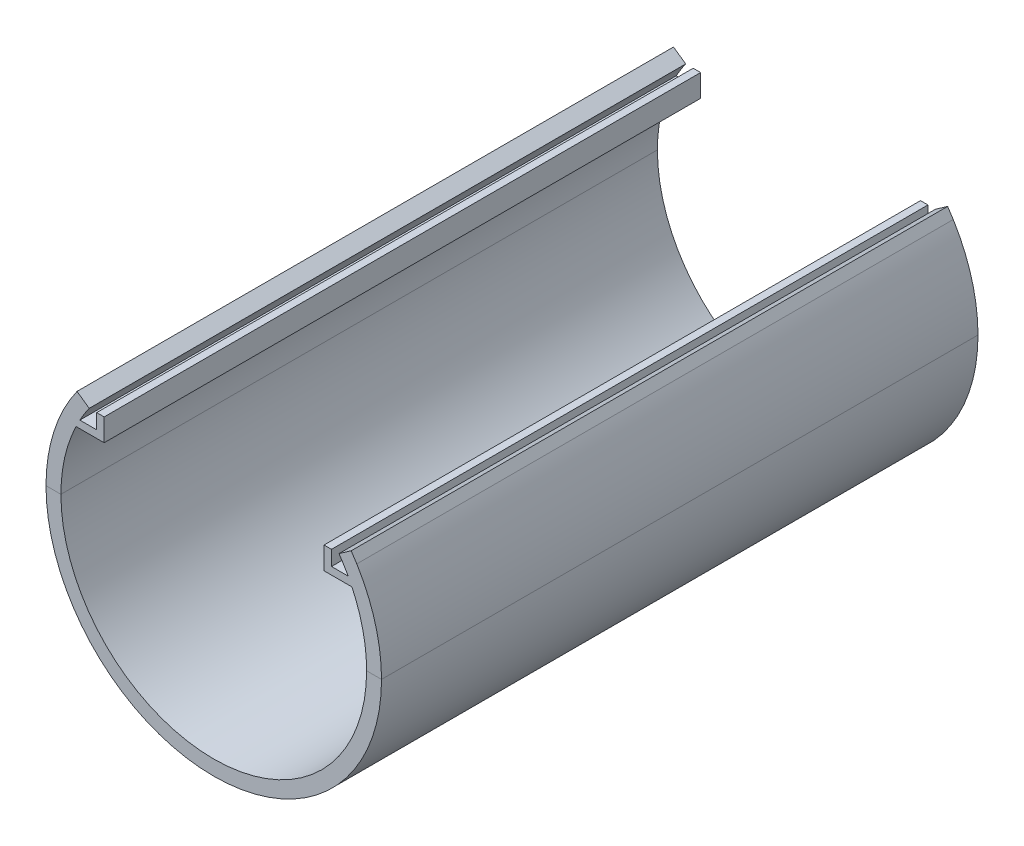
ISO-10303-21;
HEADER;
FILE_DESCRIPTION(('STEP AP214'),'2;1');
FILE_NAME('part.step','',(''),(''),'','','');
FILE_SCHEMA(('AUTOMOTIVE_DESIGN { 1 0 10303 214 1 1 1 1 }'));
ENDSEC;
DATA;
#1=APPLICATION_CONTEXT('core data for automotive mechanical design processes');
#2=APPLICATION_PROTOCOL_DEFINITION('international standard','automotive_design',2000,#1);
#3=PRODUCT_CONTEXT('',#1,'mechanical');
#4=PRODUCT('Part','Part','',(#3));
#5=PRODUCT_RELATED_PRODUCT_CATEGORY('part','',(#4));
#6=PRODUCT_DEFINITION_FORMATION('','',#4);
#7=PRODUCT_DEFINITION_CONTEXT('part definition',#1,'design');
#8=PRODUCT_DEFINITION('design','',#6,#7);
#9=PRODUCT_DEFINITION_SHAPE('','',#8);
#10=(LENGTH_UNIT() NAMED_UNIT(*) SI_UNIT(.MILLI.,.METRE.));
#11=(NAMED_UNIT(*) PLANE_ANGLE_UNIT() SI_UNIT($,.RADIAN.));
#12=(NAMED_UNIT(*) SI_UNIT($,.STERADIAN.) SOLID_ANGLE_UNIT());
#13=UNCERTAINTY_MEASURE_WITH_UNIT(LENGTH_MEASURE(1.E-05),#10,'distance_accuracy_value','');
#14=(GEOMETRIC_REPRESENTATION_CONTEXT(3) GLOBAL_UNCERTAINTY_ASSIGNED_CONTEXT((#13)) GLOBAL_UNIT_ASSIGNED_CONTEXT((#10,
#11,#12)) REPRESENTATION_CONTEXT('',''));
#15=CARTESIAN_POINT('',(0.,0.,0.));
#16=DIRECTION('',(0.,0.,1.));
#17=DIRECTION('',(1.,0.,0.));
#18=AXIS2_PLACEMENT_3D('',#15,#16,#17);
#19=CARTESIAN_POINT('',(0.,0.,0.));
#20=DIRECTION('',(0.,0.,1.));
#21=DIRECTION('',(1.,0.,0.));
#22=AXIS2_PLACEMENT_3D('',#19,#20,#21);
#23=PLANE('',#22);
#24=CARTESIAN_POINT('',(0.,0.,0.));
#25=DIRECTION('',(0.,0.,1.));
#26=DIRECTION('',(1.,0.,0.));
#27=AXIS2_PLACEMENT_3D('',#24,#25,#26);
#28=CIRCLE('',#27,20.5);
#29=CARTESIAN_POINT('',(-16.7022728372122,11.8862980810395,0.));
#30=VERTEX_POINT('',#29);
#31=CARTESIAN_POINT('',(-17.9585943284221,9.88629808103946,0.));
#32=VERTEX_POINT('',#31);
#33=EDGE_CURVE('E196',#30,#32,#28,.T.);
#34=ORIENTED_EDGE('',*,*,#33,.T.);
#35=DIRECTION('',(-1.,0.,0.));
#36=VECTOR('',#35,1.);
#37=CARTESIAN_POINT('',(-19.1040811851467,9.88629808103946,0.));
#38=LINE('',#37,#36);
#39=CARTESIAN_POINT('',(-15.7022728372122,9.88629808103946,0.));
#40=VERTEX_POINT('',#39);
#41=EDGE_CURVE('E241',#40,#32,#38,.T.);
#42=ORIENTED_EDGE('',*,*,#41,.F.);
#43=DIRECTION('',(0.,1.,0.));
#44=VECTOR('',#43,1.);
#45=CARTESIAN_POINT('',(-15.7022728372122,11.8862980810395,0.));
#46=LINE('',#45,#44);
#47=CARTESIAN_POINT('',(-15.7022728372122,11.8862980810395,0.));
#48=VERTEX_POINT('',#47);
#49=EDGE_CURVE('E245',#40,#48,#46,.T.);
#50=ORIENTED_EDGE('',*,*,#49,.T.);
#51=DIRECTION('',(1.,0.,0.));
#52=VECTOR('',#51,1.);
#53=CARTESIAN_POINT('',(-14.7022728372122,11.8862980810395,0.));
#54=LINE('',#53,#52);
#55=CARTESIAN_POINT('',(-14.7022728372122,11.8862980810395,0.));
#56=VERTEX_POINT('',#55);
#57=EDGE_CURVE('E250',#48,#56,#54,.T.);
#58=ORIENTED_EDGE('',*,*,#57,.T.);
#59=DIRECTION('',(0.,1.,0.));
#60=VECTOR('',#59,1.);
#61=CARTESIAN_POINT('',(-14.7022728372122,11.8862980810395,0.));
#62=LINE('',#61,#60);
#63=CARTESIAN_POINT('',(-14.7022728372122,8.88629808103946,0.));
#64=VERTEX_POINT('',#63);
#65=EDGE_CURVE('E253',#64,#56,#62,.T.);
#66=ORIENTED_EDGE('',*,*,#65,.F.);
#67=DIRECTION('',(-1.,0.,0.));
#68=VECTOR('',#67,1.);
#69=CARTESIAN_POINT('',(-19.1040811851467,8.88629808103946,0.));
#70=LINE('',#69,#68);
#71=CARTESIAN_POINT('',(-18.4738654973699,8.88629808103946,0.));
#72=VERTEX_POINT('',#71);
#73=EDGE_CURVE('E215',#64,#72,#70,.T.);
#74=ORIENTED_EDGE('',*,*,#73,.T.);
#75=CARTESIAN_POINT('',(-20.5,0.,0.));
#76=VERTEX_POINT('',#75);
#77=EDGE_CURVE('E205',#72,#76,#28,.T.);
#78=ORIENTED_EDGE('',*,*,#77,.T.);
#79=DIRECTION('',(-1.,0.,0.));
#80=VECTOR('',#79,1.);
#81=CARTESIAN_POINT('',(-22.5,0.,0.));
#82=LINE('',#81,#80);
#83=CARTESIAN_POINT('',(-22.5,0.,0.));
#84=VERTEX_POINT('',#83);
#85=EDGE_CURVE('E207',#76,#84,#82,.T.);
#86=ORIENTED_EDGE('',*,*,#85,.T.);
#87=CARTESIAN_POINT('',(0.,0.,0.));
#88=DIRECTION('',(0.,0.,1.));
#89=DIRECTION('',(1.,0.,0.));
#90=AXIS2_PLACEMENT_3D('',#87,#88,#89);
#91=CIRCLE('',#90,22.5);
#92=CARTESIAN_POINT('',(-18.3406205106215,13.0334814721689,0.));
#93=VERTEX_POINT('',#92);
#94=EDGE_CURVE('E103',#93,#84,#91,.T.);
#95=ORIENTED_EDGE('',*,*,#94,.F.);
#96=DIRECTION('',(0.819152044288995,-0.573576436351041,0.));
#97=VECTOR('',#96,1.);
#98=CARTESIAN_POINT('',(-16.7022728372122,11.8862980810395,0.));
#99=LINE('',#98,#97);
#100=EDGE_CURVE('E206',#93,#30,#99,.T.);
#101=ORIENTED_EDGE('',*,*,#100,.T.);
#102=EDGE_LOOP('',(#34,#42,#50,#58,#66,#74,#78,#86,#95,#101));
#103=FACE_BOUND('',#102,.T.);
#104=ADVANCED_FACE('F100',(#103),#23,.F.);
#105=CARTESIAN_POINT('',(0.,0.,80.));
#106=DIRECTION('',(0.,0.,-1.));
#107=DIRECTION('',(-1.,0.,0.));
#108=AXIS2_PLACEMENT_3D('',#105,#106,#107);
#109=PLANE('',#108);
#110=CARTESIAN_POINT('',(0.,0.,80.));
#111=DIRECTION('',(0.,0.,-1.));
#112=DIRECTION('',(-1.,0.,0.));
#113=AXIS2_PLACEMENT_3D('',#110,#111,#112);
#114=CIRCLE('',#113,20.5);
#115=CARTESIAN_POINT('',(-20.5,0.,80.));
#116=VERTEX_POINT('',#115);
#117=CARTESIAN_POINT('',(-18.4738654973699,8.88629808103946,80.));
#118=VERTEX_POINT('',#117);
#119=EDGE_CURVE('E189',#116,#118,#114,.T.);
#120=ORIENTED_EDGE('',*,*,#119,.T.);
#121=DIRECTION('',(1.,0.,0.));
#122=VECTOR('',#121,1.);
#123=CARTESIAN_POINT('',(-19.1040811851467,8.88629808103946,80.));
#124=LINE('',#123,#122);
#125=CARTESIAN_POINT('',(-14.7022728372122,8.88629808103946,80.));
#126=VERTEX_POINT('',#125);
#127=EDGE_CURVE('E246',#118,#126,#124,.T.);
#128=ORIENTED_EDGE('',*,*,#127,.T.);
#129=DIRECTION('',(0.,-1.,0.));
#130=VECTOR('',#129,1.);
#131=CARTESIAN_POINT('',(-14.7022728372122,11.8862980810395,80.));
#132=LINE('',#131,#130);
#133=CARTESIAN_POINT('',(-14.7022728372122,11.8862980810395,80.));
#134=VERTEX_POINT('',#133);
#135=EDGE_CURVE('E258',#134,#126,#132,.T.);
#136=ORIENTED_EDGE('',*,*,#135,.F.);
#137=DIRECTION('',(-1.,0.,0.));
#138=VECTOR('',#137,1.);
#139=CARTESIAN_POINT('',(-14.7022728372122,11.8862980810395,80.));
#140=LINE('',#139,#138);
#141=CARTESIAN_POINT('',(-15.7022728372122,11.8862980810395,80.));
#142=VERTEX_POINT('',#141);
#143=EDGE_CURVE('E109',#134,#142,#140,.T.);
#144=ORIENTED_EDGE('',*,*,#143,.T.);
#145=DIRECTION('',(0.,-1.,0.));
#146=VECTOR('',#145,1.);
#147=CARTESIAN_POINT('',(-15.7022728372122,11.8862980810395,80.));
#148=LINE('',#147,#146);
#149=CARTESIAN_POINT('',(-15.7022728372122,9.88629808103946,80.));
#150=VERTEX_POINT('',#149);
#151=EDGE_CURVE('E13',#142,#150,#148,.T.);
#152=ORIENTED_EDGE('',*,*,#151,.T.);
#153=DIRECTION('',(1.,0.,0.));
#154=VECTOR('',#153,1.);
#155=CARTESIAN_POINT('',(-19.1040811851467,9.88629808103946,80.));
#156=LINE('',#155,#154);
#157=CARTESIAN_POINT('',(-17.9585943284221,9.88629808103946,80.));
#158=VERTEX_POINT('',#157);
#159=EDGE_CURVE('E186',#158,#150,#156,.T.);
#160=ORIENTED_EDGE('',*,*,#159,.F.);
#161=CARTESIAN_POINT('',(-16.7022728372122,11.8862980810395,80.));
#162=VERTEX_POINT('',#161);
#163=EDGE_CURVE('E180',#158,#162,#114,.T.);
#164=ORIENTED_EDGE('',*,*,#163,.T.);
#165=DIRECTION('',(-0.819152044288995,0.573576436351041,0.));
#166=VECTOR('',#165,1.);
#167=CARTESIAN_POINT('',(-16.7022728372122,11.8862980810395,80.));
#168=LINE('',#167,#166);
#169=CARTESIAN_POINT('',(-18.3406205106215,13.0334814721689,80.));
#170=VERTEX_POINT('',#169);
#171=EDGE_CURVE('E185',#162,#170,#168,.T.);
#172=ORIENTED_EDGE('',*,*,#171,.T.);
#173=CARTESIAN_POINT('',(0.,0.,80.));
#174=DIRECTION('',(0.,0.,-1.));
#175=DIRECTION('',(-1.,0.,0.));
#176=AXIS2_PLACEMENT_3D('',#173,#174,#175);
#177=CIRCLE('',#176,22.5);
#178=CARTESIAN_POINT('',(-22.5,0.,80.));
#179=VERTEX_POINT('',#178);
#180=EDGE_CURVE('E200',#179,#170,#177,.T.);
#181=ORIENTED_EDGE('',*,*,#180,.F.);
#182=DIRECTION('',(1.,0.,0.));
#183=VECTOR('',#182,1.);
#184=CARTESIAN_POINT('',(-22.5,0.,80.));
#185=LINE('',#184,#183);
#186=EDGE_CURVE('E197',#179,#116,#185,.T.);
#187=ORIENTED_EDGE('',*,*,#186,.T.);
#188=EDGE_LOOP('',(#120,#128,#136,#144,#152,#160,#164,#172,#181,#187));
#189=FACE_BOUND('',#188,.T.);
#190=ADVANCED_FACE('F183',(#189),#109,.F.);
#191=CARTESIAN_POINT('',(-16.7022728372122,11.8862980810395,-15.0317964777569));
#192=DIRECTION('',(0.573576436351041,0.819152044288995,0.));
#193=DIRECTION('',(-0.819152044288995,0.573576436351041,0.));
#194=AXIS2_PLACEMENT_3D('',#191,#192,#193);
#195=PLANE('',#194);
#196=ORIENTED_EDGE('',*,*,#100,.F.);
#197=DIRECTION('',(0.,0.,1.));
#198=VECTOR('',#197,1.);
#199=CARTESIAN_POINT('',(-18.3406205106215,13.0334814721689,-15.0317964777569));
#200=LINE('',#199,#198);
#201=EDGE_CURVE('E173',#93,#170,#200,.T.);
#202=ORIENTED_EDGE('',*,*,#201,.T.);
#203=ORIENTED_EDGE('',*,*,#171,.F.);
#204=DIRECTION('',(0.,0.,1.));
#205=VECTOR('',#204,1.);
#206=CARTESIAN_POINT('',(-16.7022728372122,11.8862980810395,-15.0317964777569));
#207=LINE('',#206,#205);
#208=EDGE_CURVE('E193',#30,#162,#207,.T.);
#209=ORIENTED_EDGE('',*,*,#208,.F.);
#210=EDGE_LOOP('',(#196,#202,#203,#209));
#211=FACE_BOUND('',#210,.T.);
#212=ADVANCED_FACE('F199',(#211),#195,.T.);
#213=CARTESIAN_POINT('',(0.,0.,-15.0317964777569));
#214=DIRECTION('',(0.,0.,1.));
#215=DIRECTION('',(1.,0.,0.));
#216=AXIS2_PLACEMENT_3D('',#213,#214,#215);
#217=CYLINDRICAL_SURFACE('',#216,22.5);
#218=ORIENTED_EDGE('',*,*,#201,.F.);
#219=ORIENTED_EDGE('',*,*,#94,.T.);
#220=DIRECTION('',(0.,0.,1.));
#221=VECTOR('',#220,1.);
#222=CARTESIAN_POINT('',(-22.5,0.,-15.0317964777569));
#223=LINE('',#222,#221);
#224=EDGE_CURVE('E224',#84,#179,#223,.T.);
#225=ORIENTED_EDGE('',*,*,#224,.T.);
#226=ORIENTED_EDGE('',*,*,#180,.T.);
#227=EDGE_LOOP('',(#218,#219,#225,#226));
#228=FACE_BOUND('',#227,.T.);
#229=ADVANCED_FACE('F232',(#228),#217,.T.);
#230=CARTESIAN_POINT('',(-22.5,0.,-15.0317964777569));
#231=DIRECTION('',(0.,-1.,0.));
#232=DIRECTION('',(0.,0.,-1.));
#233=AXIS2_PLACEMENT_3D('',#230,#231,#232);
#234=PLANE('',#233);
#235=ORIENTED_EDGE('',*,*,#85,.F.);
#236=DIRECTION('',(0.,0.,1.));
#237=VECTOR('',#236,1.);
#238=CARTESIAN_POINT('',(-20.5,0.,-15.0317964777569));
#239=LINE('',#238,#237);
#240=EDGE_CURVE('E211',#76,#116,#239,.T.);
#241=ORIENTED_EDGE('',*,*,#240,.T.);
#242=ORIENTED_EDGE('',*,*,#186,.F.);
#243=ORIENTED_EDGE('',*,*,#224,.F.);
#244=EDGE_LOOP('',(#235,#241,#242,#243));
#245=FACE_BOUND('',#244,.T.);
#246=ADVANCED_FACE('F221',(#245),#234,.T.);
#247=CARTESIAN_POINT('',(0.,0.,-15.0317964777569));
#248=DIRECTION('',(0.,0.,1.));
#249=DIRECTION('',(1.,0.,0.));
#250=AXIS2_PLACEMENT_3D('',#247,#248,#249);
#251=CYLINDRICAL_SURFACE('',#250,20.5);
#252=DIRECTION('',(0.,0.,1.));
#253=VECTOR('',#252,1.);
#254=CARTESIAN_POINT('',(-18.4738654973699,8.88629808103946,-15.0317964777569));
#255=LINE('',#254,#253);
#256=EDGE_CURVE('E236',#118,#72,#255,.F.);
#257=ORIENTED_EDGE('',*,*,#256,.F.);
#258=ORIENTED_EDGE('',*,*,#119,.F.);
#259=ORIENTED_EDGE('',*,*,#240,.F.);
#260=ORIENTED_EDGE('',*,*,#77,.F.);
#261=EDGE_LOOP('',(#257,#258,#259,#260));
#262=FACE_BOUND('',#261,.T.);
#263=ADVANCED_FACE('F225',(#262),#251,.F.);
#264=ORIENTED_EDGE('',*,*,#163,.F.);
#265=DIRECTION('',(0.,0.,1.));
#266=VECTOR('',#265,1.);
#267=CARTESIAN_POINT('',(-17.9585943284221,9.88629808103946,-15.0317964777569));
#268=LINE('',#267,#266);
#269=EDGE_CURVE('E234',#158,#32,#268,.F.);
#270=ORIENTED_EDGE('',*,*,#269,.T.);
#271=ORIENTED_EDGE('',*,*,#33,.F.);
#272=ORIENTED_EDGE('',*,*,#208,.T.);
#273=EDGE_LOOP('',(#264,#270,#271,#272));
#274=FACE_BOUND('',#273,.T.);
#275=ADVANCED_FACE('F194',(#274),#251,.F.);
#276=CARTESIAN_POINT('',(-14.7022728372122,11.8862980810395,-15.0317964777569));
#277=DIRECTION('',(-1.,0.,0.));
#278=DIRECTION('',(0.,0.,1.));
#279=AXIS2_PLACEMENT_3D('',#276,#277,#278);
#280=PLANE('',#279);
#281=ORIENTED_EDGE('',*,*,#135,.T.);
#282=DIRECTION('',(0.,0.,1.));
#283=VECTOR('',#282,1.);
#284=CARTESIAN_POINT('',(-14.7022728372122,8.88629808103946,-15.0317964777569));
#285=LINE('',#284,#283);
#286=EDGE_CURVE('E240',#64,#126,#285,.T.);
#287=ORIENTED_EDGE('',*,*,#286,.F.);
#288=ORIENTED_EDGE('',*,*,#65,.T.);
#289=DIRECTION('',(0.,0.,1.));
#290=VECTOR('',#289,1.);
#291=CARTESIAN_POINT('',(-14.7022728372122,11.8862980810395,-15.0317964777569));
#292=LINE('',#291,#290);
#293=EDGE_CURVE('E260',#56,#134,#292,.T.);
#294=ORIENTED_EDGE('',*,*,#293,.T.);
#295=EDGE_LOOP('',(#281,#287,#288,#294));
#296=FACE_BOUND('',#295,.T.);
#297=ADVANCED_FACE('F273',(#296),#280,.F.);
#298=CARTESIAN_POINT('',(-14.7022728372122,11.8862980810395,-15.0317964777569));
#299=DIRECTION('',(0.,1.,0.));
#300=DIRECTION('',(0.,0.,1.));
#301=AXIS2_PLACEMENT_3D('',#298,#299,#300);
#302=PLANE('',#301);
#303=ORIENTED_EDGE('',*,*,#57,.F.);
#304=DIRECTION('',(0.,0.,1.));
#305=VECTOR('',#304,1.);
#306=CARTESIAN_POINT('',(-15.7022728372122,11.8862980810395,-15.0317964777569));
#307=LINE('',#306,#305);
#308=EDGE_CURVE('E118',#48,#142,#307,.T.);
#309=ORIENTED_EDGE('',*,*,#308,.T.);
#310=ORIENTED_EDGE('',*,*,#143,.F.);
#311=ORIENTED_EDGE('',*,*,#293,.F.);
#312=EDGE_LOOP('',(#303,#309,#310,#311));
#313=FACE_BOUND('',#312,.T.);
#314=ADVANCED_FACE('F272',(#313),#302,.T.);
#315=CARTESIAN_POINT('',(-19.1040811851467,8.88629808103946,-15.0317964777569));
#316=DIRECTION('',(0.,-1.,0.));
#317=DIRECTION('',(0.,0.,-1.));
#318=AXIS2_PLACEMENT_3D('',#315,#316,#317);
#319=PLANE('',#318);
#320=ORIENTED_EDGE('',*,*,#127,.F.);
#321=ORIENTED_EDGE('',*,*,#256,.T.);
#322=ORIENTED_EDGE('',*,*,#73,.F.);
#323=ORIENTED_EDGE('',*,*,#286,.T.);
#324=EDGE_LOOP('',(#320,#321,#322,#323));
#325=FACE_BOUND('',#324,.T.);
#326=ADVANCED_FACE('F267',(#325),#319,.T.);
#327=CARTESIAN_POINT('',(-15.7022728372122,11.8862980810395,-15.0317964777569));
#328=DIRECTION('',(-1.,0.,0.));
#329=DIRECTION('',(0.,0.,1.));
#330=AXIS2_PLACEMENT_3D('',#327,#328,#329);
#331=PLANE('',#330);
#332=DIRECTION('',(0.,0.,-1.));
#333=VECTOR('',#332,1.);
#334=CARTESIAN_POINT('',(-15.7022728372122,9.88629808103946,-15.0317964777569));
#335=LINE('',#334,#333);
#336=EDGE_CURVE('E188',#150,#40,#335,.T.);
#337=ORIENTED_EDGE('',*,*,#336,.F.);
#338=ORIENTED_EDGE('',*,*,#151,.F.);
#339=ORIENTED_EDGE('',*,*,#308,.F.);
#340=ORIENTED_EDGE('',*,*,#49,.F.);
#341=EDGE_LOOP('',(#337,#338,#339,#340));
#342=FACE_BOUND('',#341,.T.);
#343=ADVANCED_FACE('F278',(#342),#331,.T.);
#344=CARTESIAN_POINT('',(-19.1040811851467,9.88629808103946,-15.0317964777569));
#345=DIRECTION('',(0.,-1.,0.));
#346=DIRECTION('',(0.,0.,-1.));
#347=AXIS2_PLACEMENT_3D('',#344,#345,#346);
#348=PLANE('',#347);
#349=ORIENTED_EDGE('',*,*,#269,.F.);
#350=ORIENTED_EDGE('',*,*,#159,.T.);
#351=ORIENTED_EDGE('',*,*,#336,.T.);
#352=ORIENTED_EDGE('',*,*,#41,.T.);
#353=EDGE_LOOP('',(#349,#350,#351,#352));
#354=FACE_BOUND('',#353,.T.);
#355=ADVANCED_FACE('F280',(#354),#348,.F.);
#356=CLOSED_SHELL('',(#104,#190,#212,#229,#246,#263,#275,#297,#314,#326,#343,#355));
#357=MANIFOLD_SOLID_BREP('B2',#356);
#358=CARTESIAN_POINT('',(0.,0.,80.));
#359=DIRECTION('',(0.,0.,1.));
#360=DIRECTION('',(1.,0.,0.));
#361=AXIS2_PLACEMENT_3D('',#358,#359,#360);
#362=PLANE('',#361);
#363=CARTESIAN_POINT('',(0.,0.,80.));
#364=DIRECTION('',(0.,0.,1.));
#365=DIRECTION('',(1.,0.,0.));
#366=AXIS2_PLACEMENT_3D('',#363,#364,#365);
#367=CIRCLE('',#366,20.5);
#368=CARTESIAN_POINT('',(20.5,0.,80.));
#369=VERTEX_POINT('',#368);
#370=CARTESIAN_POINT('',(18.5348829046068,8.75831694519647,80.));
#371=VERTEX_POINT('',#370);
#372=EDGE_CURVE('E491',#369,#371,#367,.T.);
#373=ORIENTED_EDGE('',*,*,#372,.F.);
#374=DIRECTION('',(-1.,0.,0.));
#375=VECTOR('',#374,1.);
#376=CARTESIAN_POINT('',(0.,0.,80.));
#377=LINE('',#376,#375);
#378=CARTESIAN_POINT('',(22.5,0.,80.));
#379=VERTEX_POINT('',#378);
#380=EDGE_CURVE('E497',#379,#369,#377,.T.);
#381=ORIENTED_EDGE('',*,*,#380,.F.);
#382=CARTESIAN_POINT('',(0.,0.,80.));
#383=DIRECTION('',(0.,0.,1.));
#384=DIRECTION('',(1.,0.,0.));
#385=AXIS2_PLACEMENT_3D('',#382,#383,#384);
#386=CIRCLE('',#385,22.5);
#387=CARTESIAN_POINT('',(19.1831171246048,11.7583169451965,80.));
#388=VERTEX_POINT('',#387);
#389=EDGE_CURVE('E503',#379,#388,#386,.T.);
#390=ORIENTED_EDGE('',*,*,#389,.T.);
#391=DIRECTION('',(-0.548338985228356,0.836256155300956,0.));
#392=VECTOR('',#391,1.);
#393=CARTESIAN_POINT('',(18.8070190605535,12.3318933815476,80.));
#394=LINE('',#393,#392);
#395=CARTESIAN_POINT('',(18.4309209965023,12.9054698178986,80.));
#396=VERTEX_POINT('',#395);
#397=EDGE_CURVE('E512',#388,#396,#394,.T.);
#398=ORIENTED_EDGE('',*,*,#397,.T.);
#399=DIRECTION('',(0.819152044288991,0.573576436351047,0.));
#400=VECTOR('',#399,1.);
#401=CARTESIAN_POINT('',(0.,0.,80.));
#402=LINE('',#401,#400);
#403=CARTESIAN_POINT('',(16.7926169079243,11.7583169451965,80.));
#404=VERTEX_POINT('',#403);
#405=EDGE_CURVE('E515',#404,#396,#402,.T.);
#406=ORIENTED_EDGE('',*,*,#405,.F.);
#407=CARTESIAN_POINT('',(0.,0.,80.));
#408=DIRECTION('',(0.,0.,1.));
#409=DIRECTION('',(1.,0.,0.));
#410=AXIS2_PLACEMENT_3D('',#407,#408,#409);
#411=CIRCLE('',#410,20.5);
#412=CARTESIAN_POINT('',(18.028456683729,9.75831694519647,80.));
#413=VERTEX_POINT('',#412);
#414=EDGE_CURVE('E518',#413,#404,#411,.T.);
#415=ORIENTED_EDGE('',*,*,#414,.F.);
#416=DIRECTION('',(1.,0.,0.));
#417=VECTOR('',#416,1.);
#418=CARTESIAN_POINT('',(0.,9.75831694519647,80.));
#419=LINE('',#418,#417);
#420=CARTESIAN_POINT('',(15.7926169079243,9.75831694519647,80.));
#421=VERTEX_POINT('',#420);
#422=EDGE_CURVE('E521',#421,#413,#419,.T.);
#423=ORIENTED_EDGE('',*,*,#422,.F.);
#424=DIRECTION('',(0.,-1.,0.));
#425=VECTOR('',#424,1.);
#426=CARTESIAN_POINT('',(15.7926169079243,0.,80.));
#427=LINE('',#426,#425);
#428=CARTESIAN_POINT('',(15.7926169079243,11.7583169451965,80.));
#429=VERTEX_POINT('',#428);
#430=EDGE_CURVE('E524',#429,#421,#427,.T.);
#431=ORIENTED_EDGE('',*,*,#430,.F.);
#432=DIRECTION('',(-1.,0.,0.));
#433=VECTOR('',#432,1.);
#434=CARTESIAN_POINT('',(0.,11.7583169451965,80.));
#435=LINE('',#434,#433);
#436=CARTESIAN_POINT('',(14.7926169079243,11.7583169451965,80.));
#437=VERTEX_POINT('',#436);
#438=EDGE_CURVE('E527',#429,#437,#435,.T.);
#439=ORIENTED_EDGE('',*,*,#438,.T.);
#440=DIRECTION('',(0.,-1.,0.));
#441=VECTOR('',#440,1.);
#442=CARTESIAN_POINT('',(14.7926169079243,0.,80.));
#443=LINE('',#442,#441);
#444=CARTESIAN_POINT('',(14.7926169079243,8.75831694519647,80.));
#445=VERTEX_POINT('',#444);
#446=EDGE_CURVE('E530',#437,#445,#443,.T.);
#447=ORIENTED_EDGE('',*,*,#446,.T.);
#448=DIRECTION('',(-1.,0.,0.));
#449=VECTOR('',#448,1.);
#450=CARTESIAN_POINT('',(0.,8.75831694519647,80.));
#451=LINE('',#450,#449);
#452=EDGE_CURVE('E495',#371,#445,#451,.T.);
#453=ORIENTED_EDGE('',*,*,#452,.F.);
#454=EDGE_LOOP('',(#373,#381,#390,#398,#406,#415,#423,#431,#439,#447,#453));
#455=FACE_BOUND('',#454,.T.);
#456=ADVANCED_FACE('F404',(#455),#362,.T.);
#457=CARTESIAN_POINT('',(0.,0.,-15.0317964777569));
#458=DIRECTION('',(0.,1.,0.));
#459=DIRECTION('',(0.,0.,1.));
#460=AXIS2_PLACEMENT_3D('',#457,#458,#459);
#461=PLANE('',#460);
#462=DIRECTION('',(0.,0.,1.));
#463=VECTOR('',#462,1.);
#464=CARTESIAN_POINT('',(20.5,0.,-15.0317964777569));
#465=LINE('',#464,#463);
#466=CARTESIAN_POINT('',(20.5,0.,0.));
#467=VERTEX_POINT('',#466);
#468=EDGE_CURVE('E487',#467,#369,#465,.T.);
#469=ORIENTED_EDGE('',*,*,#468,.F.);
#470=DIRECTION('',(1.,0.,0.));
#471=VECTOR('',#470,1.);
#472=CARTESIAN_POINT('',(0.,0.,0.));
#473=LINE('',#472,#471);
#474=CARTESIAN_POINT('',(22.5,0.,0.));
#475=VERTEX_POINT('',#474);
#476=EDGE_CURVE('E408',#467,#475,#473,.T.);
#477=ORIENTED_EDGE('',*,*,#476,.T.);
#478=DIRECTION('',(0.,0.,1.));
#479=VECTOR('',#478,1.);
#480=CARTESIAN_POINT('',(22.5,0.,-15.0317964777569));
#481=LINE('',#480,#479);
#482=EDGE_CURVE('E494',#475,#379,#481,.T.);
#483=ORIENTED_EDGE('',*,*,#482,.T.);
#484=ORIENTED_EDGE('',*,*,#380,.T.);
#485=EDGE_LOOP('',(#469,#477,#483,#484));
#486=FACE_BOUND('',#485,.T.);
#487=ADVANCED_FACE('F498',(#486),#461,.F.);
#488=CARTESIAN_POINT('',(0.,0.,-15.0317964777569));
#489=DIRECTION('',(0.,0.,1.));
#490=DIRECTION('',(1.,0.,0.));
#491=AXIS2_PLACEMENT_3D('',#488,#489,#490);
#492=CYLINDRICAL_SURFACE('',#491,22.5);
#493=CARTESIAN_POINT('',(0.,0.,0.));
#494=DIRECTION('',(0.,0.,1.));
#495=DIRECTION('',(1.,0.,0.));
#496=AXIS2_PLACEMENT_3D('',#493,#494,#495);
#497=CIRCLE('',#496,22.5);
#498=CARTESIAN_POINT('',(19.1831171246048,11.7583169451965,0.));
#499=VERTEX_POINT('',#498);
#500=EDGE_CURVE('E556',#499,#475,#497,.F.);
#501=ORIENTED_EDGE('',*,*,#500,.F.);
#502=DIRECTION('',(0.,0.,1.));
#503=VECTOR('',#502,1.);
#504=CARTESIAN_POINT('',(19.1831171246048,11.7583169451965,-15.0317964777569));
#505=LINE('',#504,#503);
#506=EDGE_CURVE('E549',#499,#388,#505,.T.);
#507=ORIENTED_EDGE('',*,*,#506,.T.);
#508=ORIENTED_EDGE('',*,*,#389,.F.);
#509=ORIENTED_EDGE('',*,*,#482,.F.);
#510=EDGE_LOOP('',(#501,#507,#508,#509));
#511=FACE_BOUND('',#510,.T.);
#512=ADVANCED_FACE('F555',(#511),#492,.T.);
#513=CARTESIAN_POINT('',(18.8070190605535,12.3318933815476,-15.0317964777569));
#514=DIRECTION('',(0.836256155300956,0.548338985228356,0.));
#515=DIRECTION('',(-0.548338985228356,0.836256155300956,0.));
#516=AXIS2_PLACEMENT_3D('',#513,#514,#515);
#517=PLANE('',#516);
#518=DIRECTION('',(0.548338985228356,-0.836256155300956,0.));
#519=VECTOR('',#518,1.);
#520=CARTESIAN_POINT('',(18.8070190605535,12.3318933815476,0.));
#521=LINE('',#520,#519);
#522=CARTESIAN_POINT('',(18.4309209965023,12.9054698178986,0.));
#523=VERTEX_POINT('',#522);
#524=EDGE_CURVE('E601',#523,#499,#521,.T.);
#525=ORIENTED_EDGE('',*,*,#524,.F.);
#526=DIRECTION('',(0.,0.,1.));
#527=VECTOR('',#526,1.);
#528=CARTESIAN_POINT('',(18.4309209965023,12.9054698178986,-15.0317964777569));
#529=LINE('',#528,#527);
#530=EDGE_CURVE('E547',#523,#396,#529,.T.);
#531=ORIENTED_EDGE('',*,*,#530,.T.);
#532=ORIENTED_EDGE('',*,*,#397,.F.);
#533=ORIENTED_EDGE('',*,*,#506,.F.);
#534=EDGE_LOOP('',(#525,#531,#532,#533));
#535=FACE_BOUND('',#534,.T.);
#536=ADVANCED_FACE('F559',(#535),#517,.T.);
#537=CARTESIAN_POINT('',(0.,0.,-15.0317964777569));
#538=DIRECTION('',(0.573576436351047,-0.819152044288991,0.));
#539=DIRECTION('',(0.819152044288991,0.573576436351047,0.));
#540=AXIS2_PLACEMENT_3D('',#537,#538,#539);
#541=PLANE('',#540);
#542=ORIENTED_EDGE('',*,*,#530,.F.);
#543=DIRECTION('',(-0.819152044288991,-0.573576436351047,0.));
#544=VECTOR('',#543,1.);
#545=CARTESIAN_POINT('',(0.,0.,0.));
#546=LINE('',#545,#544);
#547=CARTESIAN_POINT('',(16.7926169079243,11.7583169451965,0.));
#548=VERTEX_POINT('',#547);
#549=EDGE_CURVE('E568',#523,#548,#546,.T.);
#550=ORIENTED_EDGE('',*,*,#549,.T.);
#551=DIRECTION('',(0.,0.,1.));
#552=VECTOR('',#551,1.);
#553=CARTESIAN_POINT('',(16.7926169079243,11.7583169451965,-15.0317964777569));
#554=LINE('',#553,#552);
#555=EDGE_CURVE('E545',#548,#404,#554,.T.);
#556=ORIENTED_EDGE('',*,*,#555,.T.);
#557=ORIENTED_EDGE('',*,*,#405,.T.);
#558=EDGE_LOOP('',(#542,#550,#556,#557));
#559=FACE_BOUND('',#558,.T.);
#560=ADVANCED_FACE('F565',(#559),#541,.F.);
#561=CARTESIAN_POINT('',(0.,0.,-15.0317964777569));
#562=DIRECTION('',(0.,0.,1.));
#563=DIRECTION('',(1.,0.,0.));
#564=AXIS2_PLACEMENT_3D('',#561,#562,#563);
#565=CYLINDRICAL_SURFACE('',#564,20.5);
#566=ORIENTED_EDGE('',*,*,#555,.F.);
#567=CARTESIAN_POINT('',(0.,0.,0.));
#568=DIRECTION('',(0.,0.,1.));
#569=DIRECTION('',(1.,0.,0.));
#570=AXIS2_PLACEMENT_3D('',#567,#568,#569);
#571=CIRCLE('',#570,20.5);
#572=CARTESIAN_POINT('',(18.028456683729,9.75831694519647,0.));
#573=VERTEX_POINT('',#572);
#574=EDGE_CURVE('E573',#548,#573,#571,.F.);
#575=ORIENTED_EDGE('',*,*,#574,.T.);
#576=DIRECTION('',(0.,0.,1.));
#577=VECTOR('',#576,1.);
#578=CARTESIAN_POINT('',(18.028456683729,9.75831694519647,-15.0317964777569));
#579=LINE('',#578,#577);
#580=EDGE_CURVE('E543',#573,#413,#579,.T.);
#581=ORIENTED_EDGE('',*,*,#580,.T.);
#582=ORIENTED_EDGE('',*,*,#414,.T.);
#583=EDGE_LOOP('',(#566,#575,#581,#582));
#584=FACE_BOUND('',#583,.T.);
#585=ADVANCED_FACE('F571',(#584),#565,.F.);
#586=CARTESIAN_POINT('',(0.,9.75831694519647,-15.0317964777569));
#587=DIRECTION('',(0.,-1.,0.));
#588=DIRECTION('',(0.,0.,-1.));
#589=AXIS2_PLACEMENT_3D('',#586,#587,#588);
#590=PLANE('',#589);
#591=ORIENTED_EDGE('',*,*,#580,.F.);
#592=DIRECTION('',(-1.,0.,0.));
#593=VECTOR('',#592,1.);
#594=CARTESIAN_POINT('',(0.,9.75831694519647,0.));
#595=LINE('',#594,#593);
#596=CARTESIAN_POINT('',(15.7926169079243,9.75831694519647,0.));
#597=VERTEX_POINT('',#596);
#598=EDGE_CURVE('E597',#573,#597,#595,.T.);
#599=ORIENTED_EDGE('',*,*,#598,.T.);
#600=DIRECTION('',(0.,0.,1.));
#601=VECTOR('',#600,1.);
#602=CARTESIAN_POINT('',(15.7926169079243,9.75831694519647,-15.0317964777569));
#603=LINE('',#602,#601);
#604=EDGE_CURVE('E541',#597,#421,#603,.T.);
#605=ORIENTED_EDGE('',*,*,#604,.T.);
#606=ORIENTED_EDGE('',*,*,#422,.T.);
#607=EDGE_LOOP('',(#591,#599,#605,#606));
#608=FACE_BOUND('',#607,.T.);
#609=ADVANCED_FACE('F576',(#608),#590,.F.);
#610=CARTESIAN_POINT('',(15.7926169079243,0.,-15.0317964777569));
#611=DIRECTION('',(-1.,0.,0.));
#612=DIRECTION('',(0.,0.,1.));
#613=AXIS2_PLACEMENT_3D('',#610,#611,#612);
#614=PLANE('',#613);
#615=ORIENTED_EDGE('',*,*,#604,.F.);
#616=DIRECTION('',(0.,1.,0.));
#617=VECTOR('',#616,1.);
#618=CARTESIAN_POINT('',(15.7926169079243,0.,0.));
#619=LINE('',#618,#617);
#620=CARTESIAN_POINT('',(15.7926169079243,11.7583169451965,0.));
#621=VERTEX_POINT('',#620);
#622=EDGE_CURVE('E595',#597,#621,#619,.T.);
#623=ORIENTED_EDGE('',*,*,#622,.T.);
#624=DIRECTION('',(0.,0.,1.));
#625=VECTOR('',#624,1.);
#626=CARTESIAN_POINT('',(15.7926169079243,11.7583169451965,-15.0317964777569));
#627=LINE('',#626,#625);
#628=EDGE_CURVE('E539',#621,#429,#627,.T.);
#629=ORIENTED_EDGE('',*,*,#628,.T.);
#630=ORIENTED_EDGE('',*,*,#430,.T.);
#631=EDGE_LOOP('',(#615,#623,#629,#630));
#632=FACE_BOUND('',#631,.T.);
#633=ADVANCED_FACE('F621',(#632),#614,.F.);
#634=CARTESIAN_POINT('',(0.,11.7583169451965,-15.0317964777569));
#635=DIRECTION('',(0.,1.,0.));
#636=DIRECTION('',(0.,0.,1.));
#637=AXIS2_PLACEMENT_3D('',#634,#635,#636);
#638=PLANE('',#637);
#639=DIRECTION('',(1.,0.,0.));
#640=VECTOR('',#639,1.);
#641=CARTESIAN_POINT('',(0.,11.7583169451965,0.));
#642=LINE('',#641,#640);
#643=CARTESIAN_POINT('',(14.7926169079243,11.7583169451965,0.));
#644=VERTEX_POINT('',#643);
#645=EDGE_CURVE('E587',#644,#621,#642,.T.);
#646=ORIENTED_EDGE('',*,*,#645,.F.);
#647=DIRECTION('',(0.,0.,1.));
#648=VECTOR('',#647,1.);
#649=CARTESIAN_POINT('',(14.7926169079243,11.7583169451965,-15.0317964777569));
#650=LINE('',#649,#648);
#651=EDGE_CURVE('E537',#644,#437,#650,.T.);
#652=ORIENTED_EDGE('',*,*,#651,.T.);
#653=ORIENTED_EDGE('',*,*,#438,.F.);
#654=ORIENTED_EDGE('',*,*,#628,.F.);
#655=EDGE_LOOP('',(#646,#652,#653,#654));
#656=FACE_BOUND('',#655,.T.);
#657=ADVANCED_FACE('F584',(#656),#638,.T.);
#658=CARTESIAN_POINT('',(14.7926169079243,0.,-15.0317964777569));
#659=DIRECTION('',(-1.,0.,0.));
#660=DIRECTION('',(0.,-1.,0.));
#661=AXIS2_PLACEMENT_3D('',#658,#659,#660);
#662=PLANE('',#661);
#663=DIRECTION('',(0.,1.,0.));
#664=VECTOR('',#663,1.);
#665=CARTESIAN_POINT('',(14.7926169079243,0.,0.));
#666=LINE('',#665,#664);
#667=CARTESIAN_POINT('',(14.7926169079243,8.75831694519647,0.));
#668=VERTEX_POINT('',#667);
#669=EDGE_CURVE('E425',#668,#644,#666,.T.);
#670=ORIENTED_EDGE('',*,*,#669,.F.);
#671=DIRECTION('',(0.,0.,1.));
#672=VECTOR('',#671,1.);
#673=CARTESIAN_POINT('',(14.7926169079243,8.75831694519647,-15.0317964777569));
#674=LINE('',#673,#672);
#675=EDGE_CURVE('E535',#668,#445,#674,.T.);
#676=ORIENTED_EDGE('',*,*,#675,.T.);
#677=ORIENTED_EDGE('',*,*,#446,.F.);
#678=ORIENTED_EDGE('',*,*,#651,.F.);
#679=EDGE_LOOP('',(#670,#676,#677,#678));
#680=FACE_BOUND('',#679,.T.);
#681=ADVANCED_FACE('F589',(#680),#662,.T.);
#682=CARTESIAN_POINT('',(0.,8.75831694519647,-15.0317964777569));
#683=DIRECTION('',(0.,1.,0.));
#684=DIRECTION('',(0.,0.,1.));
#685=AXIS2_PLACEMENT_3D('',#682,#683,#684);
#686=PLANE('',#685);
#687=ORIENTED_EDGE('',*,*,#675,.F.);
#688=DIRECTION('',(1.,0.,0.));
#689=VECTOR('',#688,1.);
#690=CARTESIAN_POINT('',(0.,8.75831694519647,0.));
#691=LINE('',#690,#689);
#692=CARTESIAN_POINT('',(18.5348829046068,8.75831694519647,0.));
#693=VERTEX_POINT('',#692);
#694=EDGE_CURVE('E413',#668,#693,#691,.T.);
#695=ORIENTED_EDGE('',*,*,#694,.T.);
#696=DIRECTION('',(0.,0.,1.));
#697=VECTOR('',#696,1.);
#698=CARTESIAN_POINT('',(18.5348829046068,8.75831694519647,-15.0317964777569));
#699=LINE('',#698,#697);
#700=EDGE_CURVE('E533',#693,#371,#699,.T.);
#701=ORIENTED_EDGE('',*,*,#700,.T.);
#702=ORIENTED_EDGE('',*,*,#452,.T.);
#703=EDGE_LOOP('',(#687,#695,#701,#702));
#704=FACE_BOUND('',#703,.T.);
#705=ADVANCED_FACE('F591',(#704),#686,.F.);
#706=CARTESIAN_POINT('',(0.,0.,-15.0317964777569));
#707=DIRECTION('',(0.,0.,1.));
#708=DIRECTION('',(1.,0.,0.));
#709=AXIS2_PLACEMENT_3D('',#706,#707,#708);
#710=CYLINDRICAL_SURFACE('',#709,20.5);
#711=ORIENTED_EDGE('',*,*,#700,.F.);
#712=CARTESIAN_POINT('',(0.,0.,0.));
#713=DIRECTION('',(0.,0.,1.));
#714=DIRECTION('',(1.,0.,0.));
#715=AXIS2_PLACEMENT_3D('',#712,#713,#714);
#716=CIRCLE('',#715,20.5);
#717=EDGE_CURVE('E98',#693,#467,#716,.F.);
#718=ORIENTED_EDGE('',*,*,#717,.T.);
#719=ORIENTED_EDGE('',*,*,#468,.T.);
#720=ORIENTED_EDGE('',*,*,#372,.T.);
#721=EDGE_LOOP('',(#711,#718,#719,#720));
#722=FACE_BOUND('',#721,.T.);
#723=ADVANCED_FACE('F406',(#722),#710,.F.);
#724=CARTESIAN_POINT('',(0.,0.,0.));
#725=DIRECTION('',(0.,0.,1.));
#726=DIRECTION('',(1.,0.,0.));
#727=AXIS2_PLACEMENT_3D('',#724,#725,#726);
#728=PLANE('',#727);
#729=ORIENTED_EDGE('',*,*,#694,.F.);
#730=ORIENTED_EDGE('',*,*,#669,.T.);
#731=ORIENTED_EDGE('',*,*,#645,.T.);
#732=ORIENTED_EDGE('',*,*,#622,.F.);
#733=ORIENTED_EDGE('',*,*,#598,.F.);
#734=ORIENTED_EDGE('',*,*,#574,.F.);
#735=ORIENTED_EDGE('',*,*,#549,.F.);
#736=ORIENTED_EDGE('',*,*,#524,.T.);
#737=ORIENTED_EDGE('',*,*,#500,.T.);
#738=ORIENTED_EDGE('',*,*,#476,.F.);
#739=ORIENTED_EDGE('',*,*,#717,.F.);
#740=EDGE_LOOP('',(#729,#730,#731,#732,#733,#734,#735,#736,#737,#738,#739));
#741=FACE_BOUND('',#740,.T.);
#742=ADVANCED_FACE('F603',(#741),#728,.F.);
#743=CLOSED_SHELL('',(#456,#487,#512,#536,#560,#585,#609,#633,#657,#681,#705,#723,#742));
#744=MANIFOLD_SOLID_BREP('B7',#743);
#745=CARTESIAN_POINT('',(0.,0.,80.));
#746=DIRECTION('',(0.,0.,1.));
#747=DIRECTION('',(1.,0.,0.));
#748=AXIS2_PLACEMENT_3D('',#745,#746,#747);
#749=PLANE('',#748);
#750=DIRECTION('',(1.,0.,0.));
#751=VECTOR('',#750,1.);
#752=CARTESIAN_POINT('',(-22.5,0.,80.));
#753=LINE('',#752,#751);
#754=CARTESIAN_POINT('',(-22.5,0.,80.));
#755=VERTEX_POINT('',#754);
#756=CARTESIAN_POINT('',(-20.5,0.,80.));
#757=VERTEX_POINT('',#756);
#758=EDGE_CURVE('E762',#755,#757,#753,.T.);
#759=ORIENTED_EDGE('',*,*,#758,.F.);
#760=CARTESIAN_POINT('',(0.,0.,80.));
#761=DIRECTION('',(0.,0.,1.));
#762=DIRECTION('',(1.,0.,0.));
#763=AXIS2_PLACEMENT_3D('',#760,#761,#762);
#764=CIRCLE('',#763,22.5);
#765=CARTESIAN_POINT('',(22.5,0.,80.));
#766=VERTEX_POINT('',#765);
#767=EDGE_CURVE('E793',#755,#766,#764,.T.);
#768=ORIENTED_EDGE('',*,*,#767,.T.);
#769=CARTESIAN_POINT('',(20.5,0.,80.));
#770=VERTEX_POINT('',#769);
#771=EDGE_CURVE('E806',#770,#766,#753,.T.);
#772=ORIENTED_EDGE('',*,*,#771,.F.);
#773=CARTESIAN_POINT('',(0.,0.,80.));
#774=DIRECTION('',(0.,0.,1.));
#775=DIRECTION('',(1.,0.,0.));
#776=AXIS2_PLACEMENT_3D('',#773,#774,#775);
#777=CIRCLE('',#776,20.5);
#778=EDGE_CURVE('E797',#757,#770,#777,.T.);
#779=ORIENTED_EDGE('',*,*,#778,.F.);
#780=EDGE_LOOP('',(#759,#768,#772,#779));
#781=FACE_BOUND('',#780,.T.);
#782=ADVANCED_FACE('F740',(#781),#749,.T.);
#783=CARTESIAN_POINT('',(0.,0.,0.));
#784=DIRECTION('',(0.,0.,1.));
#785=DIRECTION('',(1.,0.,0.));
#786=AXIS2_PLACEMENT_3D('',#783,#784,#785);
#787=PLANE('',#786);
#788=CARTESIAN_POINT('',(0.,0.,0.));
#789=DIRECTION('',(0.,0.,1.));
#790=DIRECTION('',(1.,0.,0.));
#791=AXIS2_PLACEMENT_3D('',#788,#789,#790);
#792=CIRCLE('',#791,22.5);
#793=CARTESIAN_POINT('',(-22.5,0.,0.));
#794=VERTEX_POINT('',#793);
#795=CARTESIAN_POINT('',(22.5,0.,0.));
#796=VERTEX_POINT('',#795);
#797=EDGE_CURVE('E791',#794,#796,#792,.T.);
#798=ORIENTED_EDGE('',*,*,#797,.F.);
#799=DIRECTION('',(1.,0.,0.));
#800=VECTOR('',#799,1.);
#801=CARTESIAN_POINT('',(-22.5,0.,0.));
#802=LINE('',#801,#800);
#803=CARTESIAN_POINT('',(-20.5,0.,0.));
#804=VERTEX_POINT('',#803);
#805=EDGE_CURVE('E778',#794,#804,#802,.T.);
#806=ORIENTED_EDGE('',*,*,#805,.T.);
#807=CARTESIAN_POINT('',(0.,0.,0.));
#808=DIRECTION('',(0.,0.,1.));
#809=DIRECTION('',(1.,0.,0.));
#810=AXIS2_PLACEMENT_3D('',#807,#808,#809);
#811=CIRCLE('',#810,20.5);
#812=CARTESIAN_POINT('',(20.5,0.,0.));
#813=VERTEX_POINT('',#812);
#814=EDGE_CURVE('E801',#804,#813,#811,.T.);
#815=ORIENTED_EDGE('',*,*,#814,.T.);
#816=EDGE_CURVE('E755',#813,#796,#802,.T.);
#817=ORIENTED_EDGE('',*,*,#816,.T.);
#818=EDGE_LOOP('',(#798,#806,#815,#817));
#819=FACE_BOUND('',#818,.T.);
#820=ADVANCED_FACE('F796',(#819),#787,.F.);
#821=CARTESIAN_POINT('',(0.,0.,80.));
#822=DIRECTION('',(0.,0.,-1.));
#823=DIRECTION('',(-1.,0.,0.));
#824=AXIS2_PLACEMENT_3D('',#821,#822,#823);
#825=CYLINDRICAL_SURFACE('',#824,22.5);
#826=ORIENTED_EDGE('',*,*,#767,.F.);
#827=DIRECTION('',(0.,0.,1.));
#828=VECTOR('',#827,1.);
#829=CARTESIAN_POINT('',(-22.5,0.,0.));
#830=LINE('',#829,#828);
#831=EDGE_CURVE('E781',#794,#755,#830,.T.);
#832=ORIENTED_EDGE('',*,*,#831,.F.);
#833=ORIENTED_EDGE('',*,*,#797,.T.);
#834=DIRECTION('',(0.,0.,1.));
#835=VECTOR('',#834,1.);
#836=CARTESIAN_POINT('',(22.5,0.,0.));
#837=LINE('',#836,#835);
#838=EDGE_CURVE('E794',#796,#766,#837,.T.);
#839=ORIENTED_EDGE('',*,*,#838,.T.);
#840=EDGE_LOOP('',(#826,#832,#833,#839));
#841=FACE_BOUND('',#840,.T.);
#842=ADVANCED_FACE('F742',(#841),#825,.T.);
#843=CARTESIAN_POINT('',(0.,0.,80.));
#844=DIRECTION('',(0.,0.,-1.));
#845=DIRECTION('',(-1.,0.,0.));
#846=AXIS2_PLACEMENT_3D('',#843,#844,#845);
#847=CYLINDRICAL_SURFACE('',#846,20.5);
#848=DIRECTION('',(0.,0.,-1.));
#849=VECTOR('',#848,1.);
#850=CARTESIAN_POINT('',(-20.5,0.,80.));
#851=LINE('',#850,#849);
#852=EDGE_CURVE('E402',#757,#804,#851,.T.);
#853=ORIENTED_EDGE('',*,*,#852,.F.);
#854=ORIENTED_EDGE('',*,*,#778,.T.);
#855=DIRECTION('',(0.,0.,-1.));
#856=VECTOR('',#855,1.);
#857=CARTESIAN_POINT('',(20.5,0.,80.));
#858=LINE('',#857,#856);
#859=EDGE_CURVE('E748',#813,#770,#858,.F.);
#860=ORIENTED_EDGE('',*,*,#859,.F.);
#861=ORIENTED_EDGE('',*,*,#814,.F.);
#862=EDGE_LOOP('',(#853,#854,#860,#861));
#863=FACE_BOUND('',#862,.T.);
#864=ADVANCED_FACE('F811',(#863),#847,.F.);
#865=CARTESIAN_POINT('',(-22.5,0.,0.));
#866=DIRECTION('',(0.,-1.,0.));
#867=DIRECTION('',(0.,0.,-1.));
#868=AXIS2_PLACEMENT_3D('',#865,#866,#867);
#869=PLANE('',#868);
#870=ORIENTED_EDGE('',*,*,#859,.T.);
#871=ORIENTED_EDGE('',*,*,#771,.T.);
#872=ORIENTED_EDGE('',*,*,#838,.F.);
#873=ORIENTED_EDGE('',*,*,#816,.F.);
#874=EDGE_LOOP('',(#870,#871,#872,#873));
#875=FACE_BOUND('',#874,.T.);
#876=ADVANCED_FACE('F805',(#875),#869,.F.);
#877=ORIENTED_EDGE('',*,*,#852,.T.);
#878=ORIENTED_EDGE('',*,*,#805,.F.);
#879=ORIENTED_EDGE('',*,*,#831,.T.);
#880=ORIENTED_EDGE('',*,*,#758,.T.);
#881=EDGE_LOOP('',(#877,#878,#879,#880));
#882=FACE_BOUND('',#881,.T.);
#883=ADVANCED_FACE('F780',(#882),#869,.F.);
#884=CLOSED_SHELL('',(#782,#820,#842,#864,#876,#883));
#885=MANIFOLD_SOLID_BREP('B92',#884);
#886=ADVANCED_BREP_SHAPE_REPRESENTATION('',(#18,#357,#744,#885),#14);
#887=SHAPE_DEFINITION_REPRESENTATION(#9,#886);
ENDSEC;
END-ISO-10303-21;
